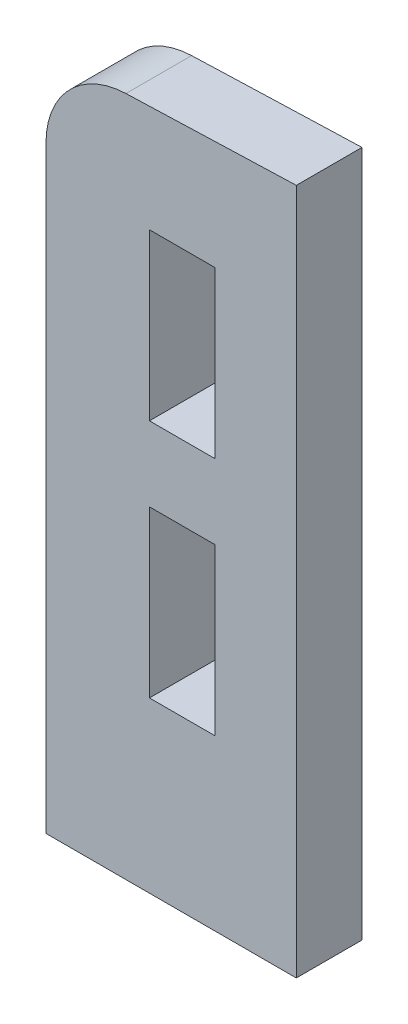
ISO-10303-21;
HEADER;
FILE_DESCRIPTION(('STEP AP214'),'2;1');
FILE_NAME('part.step','',(''),(''),'','','');
FILE_SCHEMA(('AUTOMOTIVE_DESIGN { 1 0 10303 214 1 1 1 1 }'));
ENDSEC;
DATA;
#1=APPLICATION_CONTEXT('core data for automotive mechanical design processes');
#2=APPLICATION_PROTOCOL_DEFINITION('international standard','automotive_design',2000,#1);
#3=PRODUCT_CONTEXT('',#1,'mechanical');
#4=PRODUCT('Part','Part','',(#3));
#5=PRODUCT_RELATED_PRODUCT_CATEGORY('part','',(#4));
#6=PRODUCT_DEFINITION_FORMATION('','',#4);
#7=PRODUCT_DEFINITION_CONTEXT('part definition',#1,'design');
#8=PRODUCT_DEFINITION('design','',#6,#7);
#9=PRODUCT_DEFINITION_SHAPE('','',#8);
#10=(LENGTH_UNIT() NAMED_UNIT(*) SI_UNIT(.MILLI.,.METRE.));
#11=(NAMED_UNIT(*) PLANE_ANGLE_UNIT() SI_UNIT($,.RADIAN.));
#12=(NAMED_UNIT(*) SI_UNIT($,.STERADIAN.) SOLID_ANGLE_UNIT());
#13=UNCERTAINTY_MEASURE_WITH_UNIT(LENGTH_MEASURE(1.E-05),#10,'distance_accuracy_value','');
#14=(GEOMETRIC_REPRESENTATION_CONTEXT(3) GLOBAL_UNCERTAINTY_ASSIGNED_CONTEXT((#13)) GLOBAL_UNIT_ASSIGNED_CONTEXT((#10,
#11,#12)) REPRESENTATION_CONTEXT('',''));
#15=CARTESIAN_POINT('',(0.,0.,0.));
#16=DIRECTION('',(0.,0.,1.));
#17=DIRECTION('',(1.,0.,0.));
#18=AXIS2_PLACEMENT_3D('',#15,#16,#17);
#19=CARTESIAN_POINT('',(0.,0.,0.));
#20=DIRECTION('',(0.,0.,1.));
#21=DIRECTION('',(1.,0.,0.));
#22=AXIS2_PLACEMENT_3D('',#19,#20,#21);
#23=PLANE('',#22);
#24=DIRECTION('',(-1.,0.,0.));
#25=VECTOR('',#24,1.);
#26=CARTESIAN_POINT('',(0.,1.8,0.));
#27=LINE('',#26,#25);
#28=CARTESIAN_POINT('',(-30.625,1.8,0.));
#29=VERTEX_POINT('',#28);
#30=CARTESIAN_POINT('',(-33.8,1.8,0.));
#31=VERTEX_POINT('',#30);
#32=EDGE_CURVE('E174',#29,#31,#27,.T.);
#33=ORIENTED_EDGE('',*,*,#32,.F.);
#34=DIRECTION('',(0.,-1.,0.));
#35=VECTOR('',#34,1.);
#36=CARTESIAN_POINT('',(-30.625,0.,0.));
#37=LINE('',#36,#35);
#38=CARTESIAN_POINT('',(-30.625,9.8,0.));
#39=VERTEX_POINT('',#38);
#40=EDGE_CURVE('E216',#39,#29,#37,.T.);
#41=ORIENTED_EDGE('',*,*,#40,.F.);
#42=DIRECTION('',(-1.,0.,0.));
#43=VECTOR('',#42,1.);
#44=CARTESIAN_POINT('',(0.,9.8,0.));
#45=LINE('',#44,#43);
#46=CARTESIAN_POINT('',(-33.8,9.8,0.));
#47=VERTEX_POINT('',#46);
#48=EDGE_CURVE('E181',#39,#47,#45,.T.);
#49=ORIENTED_EDGE('',*,*,#48,.T.);
#50=DIRECTION('',(0.,-1.,0.));
#51=VECTOR('',#50,1.);
#52=CARTESIAN_POINT('',(-33.8,0.,0.));
#53=LINE('',#52,#51);
#54=EDGE_CURVE('E173',#47,#31,#53,.T.);
#55=ORIENTED_EDGE('',*,*,#54,.T.);
#56=EDGE_LOOP('',(#33,#41,#49,#55));
#57=FACE_BOUND('',#56,.T.);
#58=DIRECTION('',(-1.,0.,0.));
#59=VECTOR('',#58,1.);
#60=CARTESIAN_POINT('',(0.,-9.79999999999999,0.));
#61=LINE('',#60,#59);
#62=CARTESIAN_POINT('',(-30.625,-9.79999999999999,0.));
#63=VERTEX_POINT('',#62);
#64=CARTESIAN_POINT('',(-33.8,-9.79999999999999,0.));
#65=VERTEX_POINT('',#64);
#66=EDGE_CURVE('E162',#63,#65,#61,.T.);
#67=ORIENTED_EDGE('',*,*,#66,.F.);
#68=CARTESIAN_POINT('',(-30.625,-1.79999999999999,0.));
#69=VERTEX_POINT('',#68);
#70=EDGE_CURVE('E193',#69,#63,#37,.T.);
#71=ORIENTED_EDGE('',*,*,#70,.F.);
#72=DIRECTION('',(-1.,0.,0.));
#73=VECTOR('',#72,1.);
#74=CARTESIAN_POINT('',(0.,-1.79999999999999,0.));
#75=LINE('',#74,#73);
#76=CARTESIAN_POINT('',(-33.8,-1.79999999999999,0.));
#77=VERTEX_POINT('',#76);
#78=EDGE_CURVE('E170',#69,#77,#75,.T.);
#79=ORIENTED_EDGE('',*,*,#78,.T.);
#80=DIRECTION('',(0.,-1.,0.));
#81=VECTOR('',#80,1.);
#82=CARTESIAN_POINT('',(-33.8,0.,0.));
#83=LINE('',#82,#81);
#84=EDGE_CURVE('E166',#77,#65,#83,.T.);
#85=ORIENTED_EDGE('',*,*,#84,.T.);
#86=EDGE_LOOP('',(#67,#71,#79,#85));
#87=FACE_BOUND('',#86,.T.);
#88=DIRECTION('',(0.,-1.,0.));
#89=VECTOR('',#88,1.);
#90=CARTESIAN_POINT('',(-26.7,0.,0.));
#91=LINE('',#90,#89);
#92=CARTESIAN_POINT('',(-26.7,15.2087432394143,0.));
#93=VERTEX_POINT('',#92);
#94=CARTESIAN_POINT('',(-26.7,-17.975,0.));
#95=VERTEX_POINT('',#94);
#96=EDGE_CURVE('E139',#93,#95,#91,.T.);
#97=ORIENTED_EDGE('',*,*,#96,.T.);
#98=DIRECTION('',(-1.,0.,0.));
#99=VECTOR('',#98,1.);
#100=CARTESIAN_POINT('',(-20.8,-17.975,0.));
#101=LINE('',#100,#99);
#102=CARTESIAN_POINT('',(-38.8,-17.975,0.));
#103=VERTEX_POINT('',#102);
#104=EDGE_CURVE('E142',#95,#103,#101,.T.);
#105=ORIENTED_EDGE('',*,*,#104,.T.);
#106=DIRECTION('',(0.,-1.,0.));
#107=VECTOR('',#106,1.);
#108=CARTESIAN_POINT('',(-38.8,0.,0.));
#109=LINE('',#108,#107);
#110=CARTESIAN_POINT('',(-38.8,10.9360380146031,0.));
#111=VERTEX_POINT('',#110);
#112=EDGE_CURVE('E153',#111,#103,#109,.T.);
#113=ORIENTED_EDGE('',*,*,#112,.F.);
#114=CARTESIAN_POINT('',(-34.8,10.9360380146031,0.));
#115=DIRECTION('',(0.,0.,1.));
#116=DIRECTION('',(1.,0.,0.));
#117=AXIS2_PLACEMENT_3D('',#114,#115,#116);
#118=CIRCLE('',#117,4.);
#119=CARTESIAN_POINT('',(-34.9367995007202,14.9336980672583,0.));
#120=VERTEX_POINT('',#119);
#121=EDGE_CURVE('E224',#111,#120,#118,.F.);
#122=ORIENTED_EDGE('',*,*,#121,.T.);
#123=CARTESIAN_POINT('',(135.530776045635,-4966.60068946307,0.));
#124=DIRECTION('',(0.,0.,-1.));
#125=DIRECTION('',(-1.,0.,0.));
#126=AXIS2_PLACEMENT_3D('',#123,#124,#125);
#127=CIRCLE('',#126,4984.45022529665);
#128=EDGE_CURVE('E154',#93,#120,#127,.F.);
#129=ORIENTED_EDGE('',*,*,#128,.F.);
#130=EDGE_LOOP('',(#97,#105,#113,#122,#129));
#131=FACE_BOUND('',#130,.T.);
#132=ADVANCED_FACE('F44',(#57,#87,#131),#23,.F.);
#133=CARTESIAN_POINT('',(0.,0.,3.175));
#134=DIRECTION('',(0.,0.,1.));
#135=DIRECTION('',(1.,0.,0.));
#136=AXIS2_PLACEMENT_3D('',#133,#134,#135);
#137=PLANE('',#136);
#138=DIRECTION('',(-1.,0.,0.));
#139=VECTOR('',#138,1.);
#140=CARTESIAN_POINT('',(0.,-1.79999999999999,3.175));
#141=LINE('',#140,#139);
#142=CARTESIAN_POINT('',(-30.625,-1.79999999999999,3.175));
#143=VERTEX_POINT('',#142);
#144=CARTESIAN_POINT('',(-33.8,-1.79999999999999,3.175));
#145=VERTEX_POINT('',#144);
#146=EDGE_CURVE('E195',#143,#145,#141,.T.);
#147=ORIENTED_EDGE('',*,*,#146,.F.);
#148=DIRECTION('',(0.,-1.,0.));
#149=VECTOR('',#148,1.);
#150=CARTESIAN_POINT('',(-30.625,0.,3.175));
#151=LINE('',#150,#149);
#152=CARTESIAN_POINT('',(-30.625,-9.79999999999999,3.175));
#153=VERTEX_POINT('',#152);
#154=EDGE_CURVE('E217',#143,#153,#151,.T.);
#155=ORIENTED_EDGE('',*,*,#154,.T.);
#156=DIRECTION('',(-1.,0.,0.));
#157=VECTOR('',#156,1.);
#158=CARTESIAN_POINT('',(0.,-9.79999999999999,3.175));
#159=LINE('',#158,#157);
#160=CARTESIAN_POINT('',(-33.8,-9.79999999999999,3.175));
#161=VERTEX_POINT('',#160);
#162=EDGE_CURVE('E194',#153,#161,#159,.T.);
#163=ORIENTED_EDGE('',*,*,#162,.T.);
#164=DIRECTION('',(0.,-1.,0.));
#165=VECTOR('',#164,1.);
#166=CARTESIAN_POINT('',(-33.8,0.,3.175));
#167=LINE('',#166,#165);
#168=EDGE_CURVE('E165',#145,#161,#167,.T.);
#169=ORIENTED_EDGE('',*,*,#168,.F.);
#170=EDGE_LOOP('',(#147,#155,#163,#169));
#171=FACE_BOUND('',#170,.T.);
#172=DIRECTION('',(-1.,0.,0.));
#173=VECTOR('',#172,1.);
#174=CARTESIAN_POINT('',(0.,9.8,3.175));
#175=LINE('',#174,#173);
#176=CARTESIAN_POINT('',(-30.625,9.8,3.175));
#177=VERTEX_POINT('',#176);
#178=CARTESIAN_POINT('',(-33.8,9.8,3.175));
#179=VERTEX_POINT('',#178);
#180=EDGE_CURVE('E185',#177,#179,#175,.T.);
#181=ORIENTED_EDGE('',*,*,#180,.F.);
#182=CARTESIAN_POINT('',(-30.625,1.8,3.175));
#183=VERTEX_POINT('',#182);
#184=EDGE_CURVE('E220',#177,#183,#151,.T.);
#185=ORIENTED_EDGE('',*,*,#184,.T.);
#186=DIRECTION('',(-1.,0.,0.));
#187=VECTOR('',#186,1.);
#188=CARTESIAN_POINT('',(0.,1.8,3.175));
#189=LINE('',#188,#187);
#190=CARTESIAN_POINT('',(-33.8,1.8,3.175));
#191=VERTEX_POINT('',#190);
#192=EDGE_CURVE('E190',#183,#191,#189,.T.);
#193=ORIENTED_EDGE('',*,*,#192,.T.);
#194=DIRECTION('',(0.,-1.,0.));
#195=VECTOR('',#194,1.);
#196=CARTESIAN_POINT('',(-33.8,0.,3.175));
#197=LINE('',#196,#195);
#198=EDGE_CURVE('E177',#179,#191,#197,.T.);
#199=ORIENTED_EDGE('',*,*,#198,.F.);
#200=EDGE_LOOP('',(#181,#185,#193,#199));
#201=FACE_BOUND('',#200,.T.);
#202=DIRECTION('',(-1.,0.,0.));
#203=VECTOR('',#202,1.);
#204=CARTESIAN_POINT('',(-20.8,-17.975,3.175));
#205=LINE('',#204,#203);
#206=CARTESIAN_POINT('',(-26.7,-17.975,3.175));
#207=VERTEX_POINT('',#206);
#208=CARTESIAN_POINT('',(-38.8,-17.975,3.175));
#209=VERTEX_POINT('',#208);
#210=EDGE_CURVE('E148',#207,#209,#205,.T.);
#211=ORIENTED_EDGE('',*,*,#210,.F.);
#212=DIRECTION('',(0.,-1.,0.));
#213=VECTOR('',#212,1.);
#214=CARTESIAN_POINT('',(-26.7,0.,3.175));
#215=LINE('',#214,#213);
#216=CARTESIAN_POINT('',(-26.7,15.2087432394143,3.175));
#217=VERTEX_POINT('',#216);
#218=EDGE_CURVE('E59',#217,#207,#215,.T.);
#219=ORIENTED_EDGE('',*,*,#218,.F.);
#220=CARTESIAN_POINT('',(135.530776045635,-4966.60068946307,3.175));
#221=DIRECTION('',(0.,0.,1.));
#222=DIRECTION('',(1.,0.,0.));
#223=AXIS2_PLACEMENT_3D('',#220,#221,#222);
#224=CIRCLE('',#223,4984.45022529665);
#225=CARTESIAN_POINT('',(-34.9367995007202,14.9336980672583,3.175));
#226=VERTEX_POINT('',#225);
#227=EDGE_CURVE('E65',#217,#226,#224,.T.);
#228=ORIENTED_EDGE('',*,*,#227,.T.);
#229=CARTESIAN_POINT('',(-34.8,10.9360380146031,3.175));
#230=DIRECTION('',(0.,0.,1.));
#231=DIRECTION('',(1.,0.,0.));
#232=AXIS2_PLACEMENT_3D('',#229,#230,#231);
#233=CIRCLE('',#232,4.);
#234=CARTESIAN_POINT('',(-38.8,10.9360380146031,3.175));
#235=VERTEX_POINT('',#234);
#236=EDGE_CURVE('E11',#226,#235,#233,.T.);
#237=ORIENTED_EDGE('',*,*,#236,.T.);
#238=DIRECTION('',(0.,-1.,0.));
#239=VECTOR('',#238,1.);
#240=CARTESIAN_POINT('',(-38.8,0.,3.175));
#241=LINE('',#240,#239);
#242=EDGE_CURVE('E169',#235,#209,#241,.T.);
#243=ORIENTED_EDGE('',*,*,#242,.T.);
#244=EDGE_LOOP('',(#211,#219,#228,#237,#243));
#245=FACE_BOUND('',#244,.T.);
#246=ADVANCED_FACE('F146',(#171,#201,#245),#137,.T.);
#247=CARTESIAN_POINT('',(135.530776045635,-4966.60068946307,82.2297725290536));
#248=DIRECTION('',(0.,0.,-1.));
#249=DIRECTION('',(-1.,0.,0.));
#250=AXIS2_PLACEMENT_3D('',#247,#248,#249);
#251=CYLINDRICAL_SURFACE('',#250,4984.45022529665);
#252=DIRECTION('',(0.,0.,-1.));
#253=VECTOR('',#252,1.);
#254=CARTESIAN_POINT('',(-26.7,15.2087432394143,3.175));
#255=LINE('',#254,#253);
#256=EDGE_CURVE('E136',#217,#93,#255,.T.);
#257=ORIENTED_EDGE('',*,*,#256,.T.);
#258=ORIENTED_EDGE('',*,*,#128,.T.);
#259=DIRECTION('',(0.,0.,-1.));
#260=VECTOR('',#259,1.);
#261=CARTESIAN_POINT('',(-34.9367995007202,14.9336980672592,82.2297725290536));
#262=LINE('',#261,#260);
#263=EDGE_CURVE('E52',#120,#226,#262,.F.);
#264=ORIENTED_EDGE('',*,*,#263,.T.);
#265=ORIENTED_EDGE('',*,*,#227,.F.);
#266=EDGE_LOOP('',(#257,#258,#264,#265));
#267=FACE_BOUND('',#266,.T.);
#268=ADVANCED_FACE('F150',(#267),#251,.T.);
#269=CARTESIAN_POINT('',(-20.8,-17.975,21.4528725512572));
#270=DIRECTION('',(0.,-1.,0.));
#271=DIRECTION('',(1.,0.,0.));
#272=AXIS2_PLACEMENT_3D('',#269,#270,#271);
#273=PLANE('',#272);
#274=ORIENTED_EDGE('',*,*,#104,.F.);
#275=DIRECTION('',(0.,0.,-1.));
#276=VECTOR('',#275,1.);
#277=CARTESIAN_POINT('',(-26.7,-17.975,3.175));
#278=LINE('',#277,#276);
#279=EDGE_CURVE('E143',#207,#95,#278,.T.);
#280=ORIENTED_EDGE('',*,*,#279,.F.);
#281=ORIENTED_EDGE('',*,*,#210,.T.);
#282=DIRECTION('',(0.,0.,-1.));
#283=VECTOR('',#282,1.);
#284=CARTESIAN_POINT('',(-38.8,-17.975,21.4528725512572));
#285=LINE('',#284,#283);
#286=EDGE_CURVE('E235',#209,#103,#285,.T.);
#287=ORIENTED_EDGE('',*,*,#286,.T.);
#288=EDGE_LOOP('',(#274,#280,#281,#287));
#289=FACE_BOUND('',#288,.T.);
#290=ADVANCED_FACE('F242',(#289),#273,.T.);
#291=CARTESIAN_POINT('',(-30.625,0.,33.0727537785032));
#292=DIRECTION('',(1.,0.,0.));
#293=DIRECTION('',(0.,1.,0.));
#294=AXIS2_PLACEMENT_3D('',#291,#292,#293);
#295=PLANE('',#294);
#296=DIRECTION('',(0.,0.,-1.));
#297=VECTOR('',#296,1.);
#298=CARTESIAN_POINT('',(-30.625,-9.79999999999999,33.8831524191867));
#299=LINE('',#298,#297);
#300=EDGE_CURVE('E157',#153,#63,#299,.T.);
#301=ORIENTED_EDGE('',*,*,#300,.F.);
#302=ORIENTED_EDGE('',*,*,#154,.F.);
#303=DIRECTION('',(0.,0.,-1.));
#304=VECTOR('',#303,1.);
#305=CARTESIAN_POINT('',(-30.625,-1.79999999999999,33.8831524191867));
#306=LINE('',#305,#304);
#307=EDGE_CURVE('E206',#143,#69,#306,.T.);
#308=ORIENTED_EDGE('',*,*,#307,.T.);
#309=ORIENTED_EDGE('',*,*,#70,.T.);
#310=EDGE_LOOP('',(#301,#302,#308,#309));
#311=FACE_BOUND('',#310,.T.);
#312=ADVANCED_FACE('F244',(#311),#295,.F.);
#313=DIRECTION('',(0.,0.,-1.));
#314=VECTOR('',#313,1.);
#315=CARTESIAN_POINT('',(-30.625,1.8,33.8831524191867));
#316=LINE('',#315,#314);
#317=EDGE_CURVE('E178',#183,#29,#316,.T.);
#318=ORIENTED_EDGE('',*,*,#317,.F.);
#319=ORIENTED_EDGE('',*,*,#184,.F.);
#320=DIRECTION('',(0.,0.,-1.));
#321=VECTOR('',#320,1.);
#322=CARTESIAN_POINT('',(-30.625,9.8,33.8831524191867));
#323=LINE('',#322,#321);
#324=EDGE_CURVE('E183',#177,#39,#323,.T.);
#325=ORIENTED_EDGE('',*,*,#324,.T.);
#326=ORIENTED_EDGE('',*,*,#40,.T.);
#327=EDGE_LOOP('',(#318,#319,#325,#326));
#328=FACE_BOUND('',#327,.T.);
#329=ADVANCED_FACE('F251',(#328),#295,.F.);
#330=CARTESIAN_POINT('',(-38.8,0.,33.8831524191867));
#331=DIRECTION('',(1.,0.,0.));
#332=DIRECTION('',(0.,1.,0.));
#333=AXIS2_PLACEMENT_3D('',#330,#331,#332);
#334=PLANE('',#333);
#335=ORIENTED_EDGE('',*,*,#242,.F.);
#336=DIRECTION('',(0.,0.,-1.));
#337=VECTOR('',#336,1.);
#338=CARTESIAN_POINT('',(-38.8,10.9360380146031,33.8831524191867));
#339=LINE('',#338,#337);
#340=EDGE_CURVE('E221',#235,#111,#339,.T.);
#341=ORIENTED_EDGE('',*,*,#340,.T.);
#342=ORIENTED_EDGE('',*,*,#112,.T.);
#343=ORIENTED_EDGE('',*,*,#286,.F.);
#344=EDGE_LOOP('',(#335,#341,#342,#343));
#345=FACE_BOUND('',#344,.T.);
#346=ADVANCED_FACE('F233',(#345),#334,.F.);
#347=CARTESIAN_POINT('',(0.,-9.79999999999999,33.8831524191867));
#348=DIRECTION('',(0.,-1.,0.));
#349=DIRECTION('',(0.,0.,-1.));
#350=AXIS2_PLACEMENT_3D('',#347,#348,#349);
#351=PLANE('',#350);
#352=ORIENTED_EDGE('',*,*,#162,.F.);
#353=ORIENTED_EDGE('',*,*,#300,.T.);
#354=ORIENTED_EDGE('',*,*,#66,.T.);
#355=DIRECTION('',(0.,0.,-1.));
#356=VECTOR('',#355,1.);
#357=CARTESIAN_POINT('',(-33.8,-9.79999999999999,33.8831524191867));
#358=LINE('',#357,#356);
#359=EDGE_CURVE('E198',#161,#65,#358,.T.);
#360=ORIENTED_EDGE('',*,*,#359,.F.);
#361=EDGE_LOOP('',(#352,#353,#354,#360));
#362=FACE_BOUND('',#361,.T.);
#363=ADVANCED_FACE('F269',(#362),#351,.F.);
#364=CARTESIAN_POINT('',(-33.8,0.,33.8831524191867));
#365=DIRECTION('',(1.,0.,0.));
#366=DIRECTION('',(0.,0.,-1.));
#367=AXIS2_PLACEMENT_3D('',#364,#365,#366);
#368=PLANE('',#367);
#369=DIRECTION('',(0.,0.,-1.));
#370=VECTOR('',#369,1.);
#371=CARTESIAN_POINT('',(-33.8,-1.79999999999999,33.8831524191867));
#372=LINE('',#371,#370);
#373=EDGE_CURVE('E197',#145,#77,#372,.T.);
#374=ORIENTED_EDGE('',*,*,#373,.F.);
#375=ORIENTED_EDGE('',*,*,#168,.T.);
#376=ORIENTED_EDGE('',*,*,#359,.T.);
#377=ORIENTED_EDGE('',*,*,#84,.F.);
#378=EDGE_LOOP('',(#374,#375,#376,#377));
#379=FACE_BOUND('',#378,.T.);
#380=ADVANCED_FACE('F272',(#379),#368,.T.);
#381=CARTESIAN_POINT('',(0.,-1.79999999999999,33.8831524191867));
#382=DIRECTION('',(0.,-1.,0.));
#383=DIRECTION('',(0.,0.,-1.));
#384=AXIS2_PLACEMENT_3D('',#381,#382,#383);
#385=PLANE('',#384);
#386=ORIENTED_EDGE('',*,*,#307,.F.);
#387=ORIENTED_EDGE('',*,*,#146,.T.);
#388=ORIENTED_EDGE('',*,*,#373,.T.);
#389=ORIENTED_EDGE('',*,*,#78,.F.);
#390=EDGE_LOOP('',(#386,#387,#388,#389));
#391=FACE_BOUND('',#390,.T.);
#392=ADVANCED_FACE('F276',(#391),#385,.T.);
#393=CARTESIAN_POINT('',(0.,1.8,33.8831524191867));
#394=DIRECTION('',(0.,-1.,0.));
#395=DIRECTION('',(1.,0.,0.));
#396=AXIS2_PLACEMENT_3D('',#393,#394,#395);
#397=PLANE('',#396);
#398=ORIENTED_EDGE('',*,*,#192,.F.);
#399=ORIENTED_EDGE('',*,*,#317,.T.);
#400=ORIENTED_EDGE('',*,*,#32,.T.);
#401=DIRECTION('',(0.,0.,-1.));
#402=VECTOR('',#401,1.);
#403=CARTESIAN_POINT('',(-33.8,1.8,33.8831524191867));
#404=LINE('',#403,#402);
#405=EDGE_CURVE('E188',#191,#31,#404,.T.);
#406=ORIENTED_EDGE('',*,*,#405,.F.);
#407=EDGE_LOOP('',(#398,#399,#400,#406));
#408=FACE_BOUND('',#407,.T.);
#409=ADVANCED_FACE('F280',(#408),#397,.F.);
#410=CARTESIAN_POINT('',(-33.8,0.,33.8831524191867));
#411=DIRECTION('',(1.,0.,0.));
#412=DIRECTION('',(0.,0.,-1.));
#413=AXIS2_PLACEMENT_3D('',#410,#411,#412);
#414=PLANE('',#413);
#415=DIRECTION('',(0.,0.,-1.));
#416=VECTOR('',#415,1.);
#417=CARTESIAN_POINT('',(-33.8,9.8,33.8831524191867));
#418=LINE('',#417,#416);
#419=EDGE_CURVE('E187',#179,#47,#418,.T.);
#420=ORIENTED_EDGE('',*,*,#419,.F.);
#421=ORIENTED_EDGE('',*,*,#198,.T.);
#422=ORIENTED_EDGE('',*,*,#405,.T.);
#423=ORIENTED_EDGE('',*,*,#54,.F.);
#424=EDGE_LOOP('',(#420,#421,#422,#423));
#425=FACE_BOUND('',#424,.T.);
#426=ADVANCED_FACE('F284',(#425),#414,.T.);
#427=CARTESIAN_POINT('',(0.,9.8,33.8831524191867));
#428=DIRECTION('',(0.,-1.,0.));
#429=DIRECTION('',(0.,0.,-1.));
#430=AXIS2_PLACEMENT_3D('',#427,#428,#429);
#431=PLANE('',#430);
#432=ORIENTED_EDGE('',*,*,#324,.F.);
#433=ORIENTED_EDGE('',*,*,#180,.T.);
#434=ORIENTED_EDGE('',*,*,#419,.T.);
#435=ORIENTED_EDGE('',*,*,#48,.F.);
#436=EDGE_LOOP('',(#432,#433,#434,#435));
#437=FACE_BOUND('',#436,.T.);
#438=ADVANCED_FACE('F288',(#437),#431,.T.);
#439=CARTESIAN_POINT('',(-34.8,10.9360380146031,82.2297725290536));
#440=DIRECTION('',(0.,0.,-1.));
#441=DIRECTION('',(-1.,0.,0.));
#442=AXIS2_PLACEMENT_3D('',#439,#440,#441);
#443=CYLINDRICAL_SURFACE('',#442,4.);
#444=ORIENTED_EDGE('',*,*,#236,.F.);
#445=ORIENTED_EDGE('',*,*,#263,.F.);
#446=ORIENTED_EDGE('',*,*,#121,.F.);
#447=ORIENTED_EDGE('',*,*,#340,.F.);
#448=EDGE_LOOP('',(#444,#445,#446,#447));
#449=FACE_BOUND('',#448,.T.);
#450=ADVANCED_FACE('F46',(#449),#443,.T.);
#451=CARTESIAN_POINT('',(-26.7,0.,3.175));
#452=DIRECTION('',(1.,0.,0.));
#453=DIRECTION('',(0.,0.,-1.));
#454=AXIS2_PLACEMENT_3D('',#451,#452,#453);
#455=PLANE('',#454);
#456=ORIENTED_EDGE('',*,*,#96,.F.);
#457=ORIENTED_EDGE('',*,*,#256,.F.);
#458=ORIENTED_EDGE('',*,*,#218,.T.);
#459=ORIENTED_EDGE('',*,*,#279,.T.);
#460=EDGE_LOOP('',(#456,#457,#458,#459));
#461=FACE_BOUND('',#460,.T.);
#462=ADVANCED_FACE('F137',(#461),#455,.T.);
#463=CLOSED_SHELL('',(#132,#246,#268,#290,#312,#329,#346,#363,#380,#392,#409,#426,#438,#450,#462));
#464=MANIFOLD_SOLID_BREP('B2',#463);
#465=ADVANCED_BREP_SHAPE_REPRESENTATION('',(#18,#464),#14);
#466=SHAPE_DEFINITION_REPRESENTATION(#9,#465);
ENDSEC;
END-ISO-10303-21;
